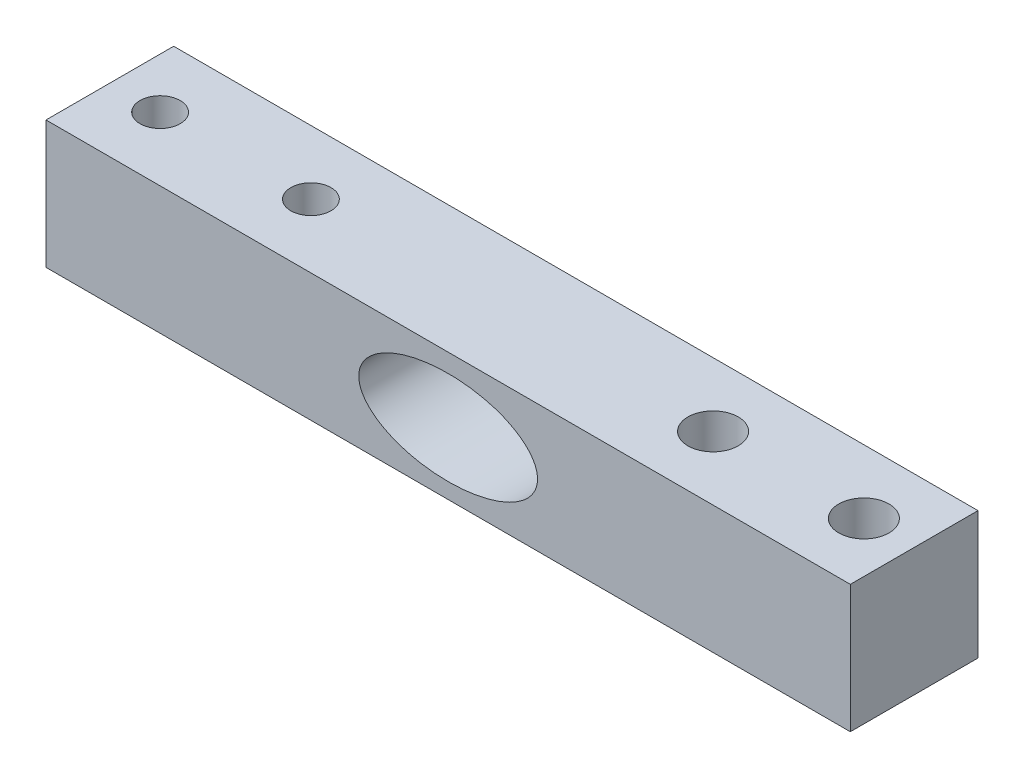
ISO-10303-21;
HEADER;
FILE_DESCRIPTION(('STEP AP214'),'2;1');
FILE_NAME('part.step','',(''),(''),'','','');
FILE_SCHEMA(('AUTOMOTIVE_DESIGN { 1 0 10303 214 1 1 1 1 }'));
ENDSEC;
DATA;
#1=APPLICATION_CONTEXT('core data for automotive mechanical design processes');
#2=APPLICATION_PROTOCOL_DEFINITION('international standard','automotive_design',2000,#1);
#3=PRODUCT_CONTEXT('',#1,'mechanical');
#4=PRODUCT('Part','Part','',(#3));
#5=PRODUCT_RELATED_PRODUCT_CATEGORY('part','',(#4));
#6=PRODUCT_DEFINITION_FORMATION('','',#4);
#7=PRODUCT_DEFINITION_CONTEXT('part definition',#1,'design');
#8=PRODUCT_DEFINITION('design','',#6,#7);
#9=PRODUCT_DEFINITION_SHAPE('','',#8);
#10=(LENGTH_UNIT() NAMED_UNIT(*) SI_UNIT(.MILLI.,.METRE.));
#11=(NAMED_UNIT(*) PLANE_ANGLE_UNIT() SI_UNIT($,.RADIAN.));
#12=(NAMED_UNIT(*) SI_UNIT($,.STERADIAN.) SOLID_ANGLE_UNIT());
#13=UNCERTAINTY_MEASURE_WITH_UNIT(LENGTH_MEASURE(1.E-05),#10,'distance_accuracy_value','');
#14=(GEOMETRIC_REPRESENTATION_CONTEXT(3) GLOBAL_UNCERTAINTY_ASSIGNED_CONTEXT((#13)) GLOBAL_UNIT_ASSIGNED_CONTEXT((#10,
#11,#12)) REPRESENTATION_CONTEXT('',''));
#15=CARTESIAN_POINT('',(0.,0.,0.));
#16=DIRECTION('',(0.,0.,1.));
#17=DIRECTION('',(1.,0.,0.));
#18=AXIS2_PLACEMENT_3D('',#15,#16,#17);
#19=CARTESIAN_POINT('',(-40.,12.7,6.35000000000001));
#20=DIRECTION('',(1.,0.,0.));
#21=DIRECTION('',(0.,0.,-1.));
#22=AXIS2_PLACEMENT_3D('',#19,#20,#21);
#23=PLANE('',#22);
#24=DIRECTION('',(0.,0.,1.));
#25=VECTOR('',#24,1.);
#26=CARTESIAN_POINT('',(-40.,0.,6.35000000000001));
#27=LINE('',#26,#25);
#28=CARTESIAN_POINT('',(-40.,0.,-6.34999999999999));
#29=VERTEX_POINT('',#28);
#30=CARTESIAN_POINT('',(-40.,0.,6.35000000000001));
#31=VERTEX_POINT('',#30);
#32=EDGE_CURVE('E110',#29,#31,#27,.T.);
#33=ORIENTED_EDGE('',*,*,#32,.T.);
#34=DIRECTION('',(0.,-1.,0.));
#35=VECTOR('',#34,1.);
#36=CARTESIAN_POINT('',(-40.,12.7,6.35000000000001));
#37=LINE('',#36,#35);
#38=CARTESIAN_POINT('',(-40.,12.7,6.35000000000001));
#39=VERTEX_POINT('',#38);
#40=EDGE_CURVE('E11',#39,#31,#37,.T.);
#41=ORIENTED_EDGE('',*,*,#40,.F.);
#42=DIRECTION('',(0.,0.,1.));
#43=VECTOR('',#42,1.);
#44=CARTESIAN_POINT('',(-40.,12.7,6.35000000000001));
#45=LINE('',#44,#43);
#46=CARTESIAN_POINT('',(-40.,12.7,-6.34999999999999));
#47=VERTEX_POINT('',#46);
#48=EDGE_CURVE('E94',#47,#39,#45,.T.);
#49=ORIENTED_EDGE('',*,*,#48,.F.);
#50=DIRECTION('',(0.,-1.,0.));
#51=VECTOR('',#50,1.);
#52=CARTESIAN_POINT('',(-40.,12.7,-6.34999999999999));
#53=LINE('',#52,#51);
#54=EDGE_CURVE('E106',#47,#29,#53,.T.);
#55=ORIENTED_EDGE('',*,*,#54,.T.);
#56=EDGE_LOOP('',(#33,#41,#49,#55));
#57=FACE_BOUND('',#56,.T.);
#58=ADVANCED_FACE('F42',(#57),#23,.F.);
#59=CARTESIAN_POINT('',(40.,12.7,6.35));
#60=DIRECTION('',(0.,0.,-1.));
#61=DIRECTION('',(-1.,0.,0.));
#62=AXIS2_PLACEMENT_3D('',#59,#60,#61);
#63=PLANE('',#62);
#64=CARTESIAN_POINT('',(0.,6.20775407012284,6.35));
#65=DIRECTION('',(0.,0.,1.));
#66=DIRECTION('',(1.,0.,0.));
#67=AXIS2_PLACEMENT_3D('',#64,#65,#66);
#68=ELLIPSE('',#67,8.89,4.6609);
#69=CARTESIAN_POINT('',(8.89,6.20775407012284,6.35));
#70=VERTEX_POINT('',#69);
#71=EDGE_CURVE('E163',#70,#70,#68,.T.);
#72=ORIENTED_EDGE('',*,*,#71,.F.);
#73=EDGE_LOOP('',(#72));
#74=FACE_BOUND('',#73,.T.);
#75=DIRECTION('',(1.,0.,0.));
#76=VECTOR('',#75,1.);
#77=CARTESIAN_POINT('',(40.,0.,6.35));
#78=LINE('',#77,#76);
#79=CARTESIAN_POINT('',(40.,0.,6.35));
#80=VERTEX_POINT('',#79);
#81=EDGE_CURVE('E99',#31,#80,#78,.T.);
#82=ORIENTED_EDGE('',*,*,#81,.T.);
#83=DIRECTION('',(0.,-1.,0.));
#84=VECTOR('',#83,1.);
#85=CARTESIAN_POINT('',(40.,12.7,6.35));
#86=LINE('',#85,#84);
#87=CARTESIAN_POINT('',(40.,12.7,6.35));
#88=VERTEX_POINT('',#87);
#89=EDGE_CURVE('E51',#88,#80,#86,.T.);
#90=ORIENTED_EDGE('',*,*,#89,.F.);
#91=DIRECTION('',(1.,0.,0.));
#92=VECTOR('',#91,1.);
#93=CARTESIAN_POINT('',(40.,12.7,6.35));
#94=LINE('',#93,#92);
#95=EDGE_CURVE('E89',#39,#88,#94,.T.);
#96=ORIENTED_EDGE('',*,*,#95,.F.);
#97=ORIENTED_EDGE('',*,*,#40,.T.);
#98=EDGE_LOOP('',(#82,#90,#96,#97));
#99=FACE_BOUND('',#98,.T.);
#100=ADVANCED_FACE('F98',(#74,#99),#63,.F.);
#101=CARTESIAN_POINT('',(40.,12.7,6.35));
#102=DIRECTION('',(-1.,0.,0.));
#103=DIRECTION('',(0.,0.,1.));
#104=AXIS2_PLACEMENT_3D('',#101,#102,#103);
#105=PLANE('',#104);
#106=DIRECTION('',(0.,0.,-1.));
#107=VECTOR('',#106,1.);
#108=CARTESIAN_POINT('',(40.,0.,6.35));
#109=LINE('',#108,#107);
#110=CARTESIAN_POINT('',(40.,0.,-6.35));
#111=VERTEX_POINT('',#110);
#112=EDGE_CURVE('E76',#80,#111,#109,.T.);
#113=ORIENTED_EDGE('',*,*,#112,.T.);
#114=DIRECTION('',(0.,-1.,0.));
#115=VECTOR('',#114,1.);
#116=CARTESIAN_POINT('',(40.,12.7,-6.35));
#117=LINE('',#116,#115);
#118=CARTESIAN_POINT('',(40.,12.7,-6.35));
#119=VERTEX_POINT('',#118);
#120=EDGE_CURVE('E101',#119,#111,#117,.T.);
#121=ORIENTED_EDGE('',*,*,#120,.F.);
#122=DIRECTION('',(0.,0.,-1.));
#123=VECTOR('',#122,1.);
#124=CARTESIAN_POINT('',(40.,12.7,6.35));
#125=LINE('',#124,#123);
#126=EDGE_CURVE('E92',#88,#119,#125,.T.);
#127=ORIENTED_EDGE('',*,*,#126,.F.);
#128=ORIENTED_EDGE('',*,*,#89,.T.);
#129=EDGE_LOOP('',(#113,#121,#127,#128));
#130=FACE_BOUND('',#129,.T.);
#131=ADVANCED_FACE('F102',(#130),#105,.F.);
#132=CARTESIAN_POINT('',(40.,12.7,-6.35));
#133=DIRECTION('',(0.,0.,1.));
#134=DIRECTION('',(1.,0.,0.));
#135=AXIS2_PLACEMENT_3D('',#132,#133,#134);
#136=PLANE('',#135);
#137=CARTESIAN_POINT('',(0.,6.20775407012284,-6.35));
#138=DIRECTION('',(0.,0.,1.));
#139=DIRECTION('',(1.,0.,0.));
#140=AXIS2_PLACEMENT_3D('',#137,#138,#139);
#141=ELLIPSE('',#140,8.89,4.6609);
#142=CARTESIAN_POINT('',(8.89,6.20775407012284,-6.35));
#143=VERTEX_POINT('',#142);
#144=EDGE_CURVE('E153',#143,#143,#141,.T.);
#145=ORIENTED_EDGE('',*,*,#144,.T.);
#146=EDGE_LOOP('',(#145));
#147=FACE_BOUND('',#146,.T.);
#148=DIRECTION('',(-1.,0.,0.));
#149=VECTOR('',#148,1.);
#150=CARTESIAN_POINT('',(40.,0.,-6.35));
#151=LINE('',#150,#149);
#152=EDGE_CURVE('E82',#111,#29,#151,.T.);
#153=ORIENTED_EDGE('',*,*,#152,.T.);
#154=ORIENTED_EDGE('',*,*,#54,.F.);
#155=DIRECTION('',(-1.,0.,0.));
#156=VECTOR('',#155,1.);
#157=CARTESIAN_POINT('',(40.,12.7,-6.35));
#158=LINE('',#157,#156);
#159=EDGE_CURVE('E59',#119,#47,#158,.T.);
#160=ORIENTED_EDGE('',*,*,#159,.F.);
#161=ORIENTED_EDGE('',*,*,#120,.T.);
#162=EDGE_LOOP('',(#153,#154,#160,#161));
#163=FACE_BOUND('',#162,.T.);
#164=ADVANCED_FACE('F124',(#147,#163),#136,.F.);
#165=CARTESIAN_POINT('',(0.,12.7,0.));
#166=DIRECTION('',(0.,1.,0.));
#167=DIRECTION('',(0.,0.,1.));
#168=AXIS2_PLACEMENT_3D('',#165,#166,#167);
#169=PLANE('',#168);
#170=CARTESIAN_POINT('',(-35.,12.7,0.));
#171=DIRECTION('',(0.,1.,0.));
#172=DIRECTION('',(0.,0.,1.));
#173=AXIS2_PLACEMENT_3D('',#170,#171,#172);
#174=CIRCLE('',#173,2.);
#175=CARTESIAN_POINT('',(-35.,12.7,2.));
#176=VERTEX_POINT('',#175);
#177=EDGE_CURVE('E148',#176,#176,#174,.T.);
#178=ORIENTED_EDGE('',*,*,#177,.F.);
#179=EDGE_LOOP('',(#178));
#180=FACE_BOUND('',#179,.T.);
#181=CARTESIAN_POINT('',(20.,12.7,0.));
#182=DIRECTION('',(0.,1.,0.));
#183=DIRECTION('',(0.,0.,1.));
#184=AXIS2_PLACEMENT_3D('',#181,#182,#183);
#185=CIRCLE('',#184,2.5);
#186=CARTESIAN_POINT('',(20.,12.7,2.5));
#187=VERTEX_POINT('',#186);
#188=EDGE_CURVE('E136',#187,#187,#185,.T.);
#189=ORIENTED_EDGE('',*,*,#188,.F.);
#190=EDGE_LOOP('',(#189));
#191=FACE_BOUND('',#190,.T.);
#192=CARTESIAN_POINT('',(35.,12.7,0.));
#193=DIRECTION('',(0.,1.,0.));
#194=DIRECTION('',(0.,0.,1.));
#195=AXIS2_PLACEMENT_3D('',#192,#193,#194);
#196=CIRCLE('',#195,2.5);
#197=CARTESIAN_POINT('',(35.,12.7,2.5));
#198=VERTEX_POINT('',#197);
#199=EDGE_CURVE('E135',#198,#198,#196,.T.);
#200=ORIENTED_EDGE('',*,*,#199,.F.);
#201=EDGE_LOOP('',(#200));
#202=FACE_BOUND('',#201,.T.);
#203=CARTESIAN_POINT('',(-20.,12.7,0.));
#204=DIRECTION('',(0.,1.,0.));
#205=DIRECTION('',(0.,0.,1.));
#206=AXIS2_PLACEMENT_3D('',#203,#204,#205);
#207=CIRCLE('',#206,2.);
#208=CARTESIAN_POINT('',(-20.,12.7,2.));
#209=VERTEX_POINT('',#208);
#210=EDGE_CURVE('E144',#209,#209,#207,.T.);
#211=ORIENTED_EDGE('',*,*,#210,.F.);
#212=EDGE_LOOP('',(#211));
#213=FACE_BOUND('',#212,.T.);
#214=ORIENTED_EDGE('',*,*,#48,.T.);
#215=ORIENTED_EDGE('',*,*,#95,.T.);
#216=ORIENTED_EDGE('',*,*,#126,.T.);
#217=ORIENTED_EDGE('',*,*,#159,.T.);
#218=EDGE_LOOP('',(#214,#215,#216,#217));
#219=FACE_BOUND('',#218,.T.);
#220=ADVANCED_FACE('F90',(#180,#191,#202,#213,#219),#169,.T.);
#221=CARTESIAN_POINT('',(0.,0.,0.));
#222=DIRECTION('',(0.,1.,0.));
#223=DIRECTION('',(0.,0.,1.));
#224=AXIS2_PLACEMENT_3D('',#221,#222,#223);
#225=PLANE('',#224);
#226=CARTESIAN_POINT('',(-35.,0.,0.));
#227=DIRECTION('',(0.,1.,0.));
#228=DIRECTION('',(0.,0.,1.));
#229=AXIS2_PLACEMENT_3D('',#226,#227,#228);
#230=CIRCLE('',#229,2.);
#231=CARTESIAN_POINT('',(-35.,0.,2.));
#232=VERTEX_POINT('',#231);
#233=EDGE_CURVE('E114',#232,#232,#230,.T.);
#234=ORIENTED_EDGE('',*,*,#233,.T.);
#235=EDGE_LOOP('',(#234));
#236=FACE_BOUND('',#235,.T.);
#237=CARTESIAN_POINT('',(20.,0.,0.));
#238=DIRECTION('',(0.,1.,0.));
#239=DIRECTION('',(0.,0.,1.));
#240=AXIS2_PLACEMENT_3D('',#237,#238,#239);
#241=CIRCLE('',#240,2.5);
#242=CARTESIAN_POINT('',(20.,0.,2.5));
#243=VERTEX_POINT('',#242);
#244=EDGE_CURVE('E149',#243,#243,#241,.T.);
#245=ORIENTED_EDGE('',*,*,#244,.T.);
#246=EDGE_LOOP('',(#245));
#247=FACE_BOUND('',#246,.T.);
#248=CARTESIAN_POINT('',(35.,0.,0.));
#249=DIRECTION('',(0.,1.,0.));
#250=DIRECTION('',(0.,0.,1.));
#251=AXIS2_PLACEMENT_3D('',#248,#249,#250);
#252=CIRCLE('',#251,2.5);
#253=CARTESIAN_POINT('',(35.,0.,2.5));
#254=VERTEX_POINT('',#253);
#255=EDGE_CURVE('E131',#254,#254,#252,.T.);
#256=ORIENTED_EDGE('',*,*,#255,.T.);
#257=EDGE_LOOP('',(#256));
#258=FACE_BOUND('',#257,.T.);
#259=CARTESIAN_POINT('',(-20.,0.,0.));
#260=DIRECTION('',(0.,1.,0.));
#261=DIRECTION('',(0.,0.,1.));
#262=AXIS2_PLACEMENT_3D('',#259,#260,#261);
#263=CIRCLE('',#262,2.);
#264=CARTESIAN_POINT('',(-20.,0.,2.));
#265=VERTEX_POINT('',#264);
#266=EDGE_CURVE('E140',#265,#265,#263,.T.);
#267=ORIENTED_EDGE('',*,*,#266,.T.);
#268=EDGE_LOOP('',(#267));
#269=FACE_BOUND('',#268,.T.);
#270=ORIENTED_EDGE('',*,*,#32,.F.);
#271=ORIENTED_EDGE('',*,*,#152,.F.);
#272=ORIENTED_EDGE('',*,*,#112,.F.);
#273=ORIENTED_EDGE('',*,*,#81,.F.);
#274=EDGE_LOOP('',(#270,#271,#272,#273));
#275=FACE_BOUND('',#274,.T.);
#276=ADVANCED_FACE('F127',(#236,#247,#258,#269,#275),#225,.F.);
#277=CARTESIAN_POINT('',(-20.,0.,0.));
#278=DIRECTION('',(0.,1.,0.));
#279=DIRECTION('',(0.,0.,1.));
#280=AXIS2_PLACEMENT_3D('',#277,#278,#279);
#281=CYLINDRICAL_SURFACE('',#280,2.);
#282=ORIENTED_EDGE('',*,*,#266,.F.);
#283=EDGE_LOOP('',(#282));
#284=FACE_BOUND('',#283,.T.);
#285=ORIENTED_EDGE('',*,*,#210,.T.);
#286=EDGE_LOOP('',(#285));
#287=FACE_BOUND('',#286,.T.);
#288=ADVANCED_FACE('F184',(#284,#287),#281,.F.);
#289=CARTESIAN_POINT('',(35.,0.,0.));
#290=DIRECTION('',(0.,1.,0.));
#291=DIRECTION('',(0.,0.,1.));
#292=AXIS2_PLACEMENT_3D('',#289,#290,#291);
#293=CYLINDRICAL_SURFACE('',#292,2.5);
#294=ORIENTED_EDGE('',*,*,#255,.F.);
#295=EDGE_LOOP('',(#294));
#296=FACE_BOUND('',#295,.T.);
#297=ORIENTED_EDGE('',*,*,#199,.T.);
#298=EDGE_LOOP('',(#297));
#299=FACE_BOUND('',#298,.T.);
#300=ADVANCED_FACE('F182',(#296,#299),#293,.F.);
#301=CARTESIAN_POINT('',(20.,0.,0.));
#302=DIRECTION('',(0.,1.,0.));
#303=DIRECTION('',(0.,0.,1.));
#304=AXIS2_PLACEMENT_3D('',#301,#302,#303);
#305=CYLINDRICAL_SURFACE('',#304,2.5);
#306=ORIENTED_EDGE('',*,*,#244,.F.);
#307=EDGE_LOOP('',(#306));
#308=FACE_BOUND('',#307,.T.);
#309=ORIENTED_EDGE('',*,*,#188,.T.);
#310=EDGE_LOOP('',(#309));
#311=FACE_BOUND('',#310,.T.);
#312=ADVANCED_FACE('F178',(#308,#311),#305,.F.);
#313=CARTESIAN_POINT('',(-35.,0.,0.));
#314=DIRECTION('',(0.,1.,0.));
#315=DIRECTION('',(0.,0.,1.));
#316=AXIS2_PLACEMENT_3D('',#313,#314,#315);
#317=CYLINDRICAL_SURFACE('',#316,2.);
#318=ORIENTED_EDGE('',*,*,#233,.F.);
#319=EDGE_LOOP('',(#318));
#320=FACE_BOUND('',#319,.T.);
#321=ORIENTED_EDGE('',*,*,#177,.T.);
#322=EDGE_LOOP('',(#321));
#323=FACE_BOUND('',#322,.T.);
#324=ADVANCED_FACE('F174',(#320,#323),#317,.F.);
#325=DIRECTION('',(0.,0.,1.));
#326=VECTOR('',#325,1.);
#327=SURFACE_OF_LINEAR_EXTRUSION('',#141,#326);
#328=ORIENTED_EDGE('',*,*,#144,.F.);
#329=EDGE_LOOP('',(#328));
#330=FACE_BOUND('',#329,.T.);
#331=ORIENTED_EDGE('',*,*,#71,.T.);
#332=EDGE_LOOP('',(#331));
#333=FACE_BOUND('',#332,.T.);
#334=ADVANCED_FACE('F171',(#330,#333),#327,.F.);
#335=CLOSED_SHELL('',(#58,#100,#131,#164,#220,#276,#288,#300,#312,#324,#334));
#336=MANIFOLD_SOLID_BREP('B2',#335);
#337=ADVANCED_BREP_SHAPE_REPRESENTATION('',(#18,#336),#14);
#338=SHAPE_DEFINITION_REPRESENTATION(#9,#337);
ENDSEC;
END-ISO-10303-21;
